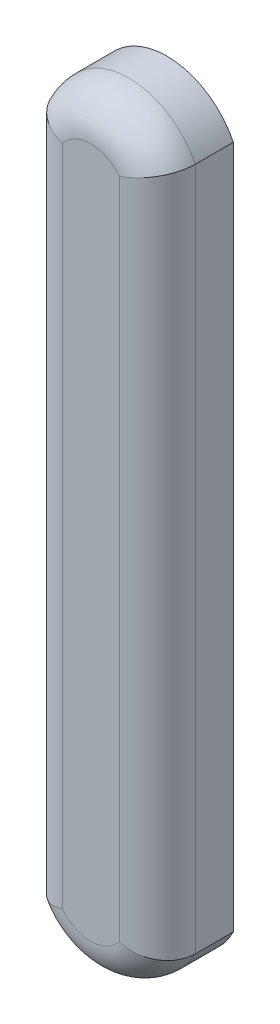
ISO-10303-21;
HEADER;
FILE_DESCRIPTION(('STEP AP214'),'2;1');
FILE_NAME('part.step','',(''),(''),'','','');
FILE_SCHEMA(('AUTOMOTIVE_DESIGN { 1 0 10303 214 1 1 1 1 }'));
ENDSEC;
DATA;
#1=APPLICATION_CONTEXT('core data for automotive mechanical design processes');
#2=APPLICATION_PROTOCOL_DEFINITION('international standard','automotive_design',2000,#1);
#3=PRODUCT_CONTEXT('',#1,'mechanical');
#4=PRODUCT('Part','Part','',(#3));
#5=PRODUCT_RELATED_PRODUCT_CATEGORY('part','',(#4));
#6=PRODUCT_DEFINITION_FORMATION('','',#4);
#7=PRODUCT_DEFINITION_CONTEXT('part definition',#1,'design');
#8=PRODUCT_DEFINITION('design','',#6,#7);
#9=PRODUCT_DEFINITION_SHAPE('','',#8);
#10=(LENGTH_UNIT() NAMED_UNIT(*) SI_UNIT(.MILLI.,.METRE.));
#11=(NAMED_UNIT(*) PLANE_ANGLE_UNIT() SI_UNIT($,.RADIAN.));
#12=(NAMED_UNIT(*) SI_UNIT($,.STERADIAN.) SOLID_ANGLE_UNIT());
#13=UNCERTAINTY_MEASURE_WITH_UNIT(LENGTH_MEASURE(1.E-05),#10,'distance_accuracy_value','');
#14=(GEOMETRIC_REPRESENTATION_CONTEXT(3) GLOBAL_UNCERTAINTY_ASSIGNED_CONTEXT((#13)) GLOBAL_UNIT_ASSIGNED_CONTEXT((#10,
#11,#12)) REPRESENTATION_CONTEXT('',''));
#15=CARTESIAN_POINT('',(0.,0.,0.));
#16=DIRECTION('',(0.,0.,1.));
#17=DIRECTION('',(1.,0.,0.));
#18=AXIS2_PLACEMENT_3D('',#15,#16,#17);
#19=CARTESIAN_POINT('',(0.175,0.085969826745946,0.2));
#20=DIRECTION('',(0.,0.,-1.));
#21=DIRECTION('',(-1.,0.,0.));
#22=AXIS2_PLACEMENT_3D('',#19,#20,#21);
#23=CYLINDRICAL_SURFACE('',#22,0.194976437321867);
#24=DIRECTION('',(0.,0.,-1.));
#25=VECTOR('',#24,1.);
#26=CARTESIAN_POINT('',(0.35,0.,0.2));
#27=LINE('',#26,#25);
#28=CARTESIAN_POINT('',(0.35,0.,0.1));
#29=VERTEX_POINT('',#28);
#30=CARTESIAN_POINT('',(0.35,0.,0.));
#31=VERTEX_POINT('',#30);
#32=EDGE_CURVE('E92',#29,#31,#27,.T.);
#33=ORIENTED_EDGE('',*,*,#32,.F.);
#34=CARTESIAN_POINT('',(0.175,0.085969826745946,0.1));
#35=DIRECTION('',(0.,0.,1.));
#36=DIRECTION('',(1.,0.,0.));
#37=AXIS2_PLACEMENT_3D('',#34,#35,#36);
#38=CIRCLE('',#37,0.194976437321867);
#39=CARTESIAN_POINT('',(0.,0.,0.1));
#40=VERTEX_POINT('',#39);
#41=EDGE_CURVE('E134',#29,#40,#38,.F.);
#42=ORIENTED_EDGE('',*,*,#41,.T.);
#43=DIRECTION('',(0.,0.,-1.));
#44=VECTOR('',#43,1.);
#45=CARTESIAN_POINT('',(0.,0.,0.2));
#46=LINE('',#45,#44);
#47=CARTESIAN_POINT('',(0.,0.,0.));
#48=VERTEX_POINT('',#47);
#49=EDGE_CURVE('E113',#40,#48,#46,.T.);
#50=ORIENTED_EDGE('',*,*,#49,.T.);
#51=CARTESIAN_POINT('',(0.175,0.085969826745946,0.));
#52=DIRECTION('',(0.,0.,1.));
#53=DIRECTION('',(1.,0.,0.));
#54=AXIS2_PLACEMENT_3D('',#51,#52,#53);
#55=CIRCLE('',#54,0.194976437321867);
#56=EDGE_CURVE('E109',#48,#31,#55,.T.);
#57=ORIENTED_EDGE('',*,*,#56,.T.);
#58=EDGE_LOOP('',(#33,#42,#50,#57));
#59=FACE_BOUND('',#58,.T.);
#60=ADVANCED_FACE('F33',(#59),#23,.T.);
#61=CARTESIAN_POINT('',(0.35,0.,0.2));
#62=DIRECTION('',(-1.,0.,0.));
#63=DIRECTION('',(0.,-1.,0.));
#64=AXIS2_PLACEMENT_3D('',#61,#62,#63);
#65=PLANE('',#64);
#66=DIRECTION('',(0.,0.,-1.));
#67=VECTOR('',#66,1.);
#68=CARTESIAN_POINT('',(0.35,1.8,0.2));
#69=LINE('',#68,#67);
#70=CARTESIAN_POINT('',(0.35,1.8,0.1));
#71=VERTEX_POINT('',#70);
#72=CARTESIAN_POINT('',(0.35,1.8,0.));
#73=VERTEX_POINT('',#72);
#74=EDGE_CURVE('E103',#71,#73,#69,.T.);
#75=ORIENTED_EDGE('',*,*,#74,.F.);
#76=DIRECTION('',(0.,1.,0.));
#77=VECTOR('',#76,1.);
#78=CARTESIAN_POINT('',(0.35,0.,0.1));
#79=LINE('',#78,#77);
#80=EDGE_CURVE('E47',#71,#29,#79,.F.);
#81=ORIENTED_EDGE('',*,*,#80,.T.);
#82=ORIENTED_EDGE('',*,*,#32,.T.);
#83=DIRECTION('',(0.,1.,0.));
#84=VECTOR('',#83,1.);
#85=CARTESIAN_POINT('',(0.35,0.,0.));
#86=LINE('',#85,#84);
#87=EDGE_CURVE('E95',#31,#73,#86,.T.);
#88=ORIENTED_EDGE('',*,*,#87,.T.);
#89=EDGE_LOOP('',(#75,#81,#82,#88));
#90=FACE_BOUND('',#89,.T.);
#91=ADVANCED_FACE('F94',(#90),#65,.F.);
#92=CARTESIAN_POINT('',(0.175,1.71403017325405,0.2));
#93=DIRECTION('',(0.,0.,-1.));
#94=DIRECTION('',(-1.,0.,0.));
#95=AXIS2_PLACEMENT_3D('',#92,#93,#94);
#96=CYLINDRICAL_SURFACE('',#95,0.194976437321867);
#97=DIRECTION('',(0.,0.,-1.));
#98=VECTOR('',#97,1.);
#99=CARTESIAN_POINT('',(0.,1.8,0.2));
#100=LINE('',#99,#98);
#101=CARTESIAN_POINT('',(0.,1.8,0.1));
#102=VERTEX_POINT('',#101);
#103=CARTESIAN_POINT('',(0.,1.8,0.));
#104=VERTEX_POINT('',#103);
#105=EDGE_CURVE('E123',#102,#104,#100,.T.);
#106=ORIENTED_EDGE('',*,*,#105,.F.);
#107=CARTESIAN_POINT('',(0.175,1.71403017325405,0.1));
#108=DIRECTION('',(0.,0.,1.));
#109=DIRECTION('',(1.,0.,0.));
#110=AXIS2_PLACEMENT_3D('',#107,#108,#109);
#111=CIRCLE('',#110,0.194976437321867);
#112=EDGE_CURVE('E11',#102,#71,#111,.F.);
#113=ORIENTED_EDGE('',*,*,#112,.T.);
#114=ORIENTED_EDGE('',*,*,#74,.T.);
#115=CARTESIAN_POINT('',(0.175,1.71403017325405,0.));
#116=DIRECTION('',(0.,0.,1.));
#117=DIRECTION('',(-1.,0.,0.));
#118=AXIS2_PLACEMENT_3D('',#115,#116,#117);
#119=CIRCLE('',#118,0.194976437321867);
#120=EDGE_CURVE('E111',#73,#104,#119,.T.);
#121=ORIENTED_EDGE('',*,*,#120,.T.);
#122=EDGE_LOOP('',(#106,#113,#114,#121));
#123=FACE_BOUND('',#122,.T.);
#124=ADVANCED_FACE('F176',(#123),#96,.T.);
#125=CARTESIAN_POINT('',(0.,0.,0.2));
#126=DIRECTION('',(1.,0.,0.));
#127=DIRECTION('',(0.,0.,-1.));
#128=AXIS2_PLACEMENT_3D('',#125,#126,#127);
#129=PLANE('',#128);
#130=ORIENTED_EDGE('',*,*,#49,.F.);
#131=DIRECTION('',(0.,-1.,0.));
#132=VECTOR('',#131,1.);
#133=CARTESIAN_POINT('',(0.,1.8,0.1));
#134=LINE('',#133,#132);
#135=EDGE_CURVE('E61',#40,#102,#134,.F.);
#136=ORIENTED_EDGE('',*,*,#135,.T.);
#137=ORIENTED_EDGE('',*,*,#105,.T.);
#138=DIRECTION('',(0.,-1.,0.));
#139=VECTOR('',#138,1.);
#140=CARTESIAN_POINT('',(0.,0.,0.));
#141=LINE('',#140,#139);
#142=EDGE_CURVE('E120',#104,#48,#141,.T.);
#143=ORIENTED_EDGE('',*,*,#142,.T.);
#144=EDGE_LOOP('',(#130,#136,#137,#143));
#145=FACE_BOUND('',#144,.T.);
#146=ADVANCED_FACE('F175',(#145),#129,.F.);
#147=CARTESIAN_POINT('',(0.175,0.085969826745946,0.2));
#148=DIRECTION('',(0.,0.,1.));
#149=DIRECTION('',(1.,0.,0.));
#150=AXIS2_PLACEMENT_3D('',#147,#148,#149);
#151=PLANE('',#150);
#152=DIRECTION('',(0.,-1.,0.));
#153=VECTOR('',#152,1.);
#154=CARTESIAN_POINT('',(0.1,0.,0.2));
#155=LINE('',#154,#153);
#156=CARTESIAN_POINT('',(0.100000000000006,1.77230129514437,0.2));
#157=VERTEX_POINT('',#156);
#158=CARTESIAN_POINT('',(0.1,0.0276987048556347,0.2));
#159=VERTEX_POINT('',#158);
#160=EDGE_CURVE('E129',#157,#159,#155,.T.);
#161=ORIENTED_EDGE('',*,*,#160,.T.);
#162=CARTESIAN_POINT('',(0.175,0.085969826745946,0.2));
#163=DIRECTION('',(0.,0.,1.));
#164=DIRECTION('',(1.,0.,0.));
#165=AXIS2_PLACEMENT_3D('',#162,#163,#164);
#166=CIRCLE('',#165,0.0949764373218671);
#167=CARTESIAN_POINT('',(0.25,0.027698704855635,0.2));
#168=VERTEX_POINT('',#167);
#169=EDGE_CURVE('E131',#159,#168,#166,.T.);
#170=ORIENTED_EDGE('',*,*,#169,.T.);
#171=DIRECTION('',(0.,1.,0.));
#172=VECTOR('',#171,1.);
#173=CARTESIAN_POINT('',(0.25,1.8,0.2));
#174=LINE('',#173,#172);
#175=CARTESIAN_POINT('',(0.249999999999993,1.77230129514436,0.2));
#176=VERTEX_POINT('',#175);
#177=EDGE_CURVE('E127',#168,#176,#174,.T.);
#178=ORIENTED_EDGE('',*,*,#177,.T.);
#179=CARTESIAN_POINT('',(0.175,1.71403017325405,0.2));
#180=DIRECTION('',(0.,0.,1.));
#181=DIRECTION('',(1.,0.,0.));
#182=AXIS2_PLACEMENT_3D('',#179,#180,#181);
#183=CIRCLE('',#182,0.0949764373218669);
#184=EDGE_CURVE('E102',#176,#157,#183,.T.);
#185=ORIENTED_EDGE('',*,*,#184,.T.);
#186=EDGE_LOOP('',(#161,#170,#178,#185));
#187=FACE_BOUND('',#186,.T.);
#188=ADVANCED_FACE('F180',(#187),#151,.T.);
#189=CARTESIAN_POINT('',(0.175,0.085969826745946,0.));
#190=DIRECTION('',(0.,0.,1.));
#191=DIRECTION('',(1.,0.,0.));
#192=AXIS2_PLACEMENT_3D('',#189,#190,#191);
#193=PLANE('',#192);
#194=ORIENTED_EDGE('',*,*,#56,.F.);
#195=ORIENTED_EDGE('',*,*,#142,.F.);
#196=ORIENTED_EDGE('',*,*,#120,.F.);
#197=ORIENTED_EDGE('',*,*,#87,.F.);
#198=EDGE_LOOP('',(#194,#195,#196,#197));
#199=FACE_BOUND('',#198,.T.);
#200=ADVANCED_FACE('F107',(#199),#193,.F.);
#201=CARTESIAN_POINT('',(0.175,1.71403017325405,0.1));
#202=DIRECTION('',(0.,0.,1.));
#203=DIRECTION('',(1.,0.,0.));
#204=AXIS2_PLACEMENT_3D('',#201,#202,#203);
#205=DEGENERATE_TOROIDAL_SURFACE('',#204,0.0949764373218669,0.1,.T.);
#206=CARTESIAN_POINT('',(0.35,1.8,0.1));
#207=CARTESIAN_POINT('',(0.350005268670267,1.80000040754592,0.105511252154056));
#208=CARTESIAN_POINT('',(0.349544726083473,1.79989418803524,0.111020433796739));
#209=CARTESIAN_POINT('',(0.347731528858172,1.79947173953325,0.121874551323155));
#210=CARTESIAN_POINT('',(0.346380049196348,1.79915578713593,0.127219693839957));
#211=CARTESIAN_POINT('',(0.342823791248484,1.79831698281915,0.137602422816504));
#212=CARTESIAN_POINT('',(0.340618769337371,1.7977940718269,0.142639920990146));
#213=CARTESIAN_POINT('',(0.335428566635514,1.79654702816146,0.152267062418119));
#214=CARTESIAN_POINT('',(0.332443445191161,1.79582291079487,0.156856739704144));
#215=CARTESIAN_POINT('',(0.325756614399062,1.79417319123095,0.165506423196409));
#216=CARTESIAN_POINT('',(0.322048708236535,1.79324583736037,0.169561300463762));
#217=CARTESIAN_POINT('',(0.314048358880856,1.79120195336536,0.176991039421652));
#218=CARTESIAN_POINT('',(0.309755728604854,1.79008536266644,0.18036568261043));
#219=CARTESIAN_POINT('',(0.30060896875744,1.7876441832273,0.186426554884238));
#220=CARTESIAN_POINT('',(0.295743946563813,1.78631529375002,0.189094582015616));
#221=CARTESIAN_POINT('',(0.285685701853069,1.78347998727226,0.193577836216799));
#222=CARTESIAN_POINT('',(0.280492611405467,1.78197364150132,0.195393404007875));
#223=CARTESIAN_POINT('',(0.271464682749297,1.77925574089153,0.197746196020681));
#224=CARTESIAN_POINT('',(0.267672328405755,1.77808525366685,0.198501401199194));
#225=CARTESIAN_POINT('',(0.260055477527481,1.77566401718499,0.199567195235984));
#226=CARTESIAN_POINT('',(0.25623103898922,1.77441339335639,0.199878461996797));
#227=CARTESIAN_POINT('',(0.251610866919886,1.77285157075458,0.199990299901761));
#228=CARTESIAN_POINT('',(0.250805058561447,1.77257728559771,0.200000031817378));
#229=CARTESIAN_POINT('',(0.25,1.77230129514436,0.2));
#230=B_SPLINE_CURVE_WITH_KNOTS('',3,(#206,#207,#208,#209,#210,#211,#212,#213,#214,#215,#216,
#217,#218,#219,#220,#221,#222,#223,#224,#225,#226,#227,#228,#229),.UNSPECIFIED.,.F.,.F.,(4,2,2,
2,2,2,2,2,2,2,2,4),(0.,0.0165104363716612,0.0329991420587914,0.0494925575628399,
0.0659847186886619,0.0826250435228637,0.0992707050000554,0.116310692768043,0.133343863977416,
0.145441145514401,0.157519934417857,0.160073462740983),.UNSPECIFIED.);
#231=EDGE_CURVE('E117',#71,#176,#230,.T.);
#232=ORIENTED_EDGE('',*,*,#231,.F.);
#233=ORIENTED_EDGE('',*,*,#112,.F.);
#234=CARTESIAN_POINT('',(0.,1.8,0.1));
#235=CARTESIAN_POINT('',(-5.26867026747834E-06,1.80000040754592,0.105511252154056));
#236=CARTESIAN_POINT('',(0.000455273916526679,1.79989418803524,0.111020433796739));
#237=CARTESIAN_POINT('',(0.00226847114182762,1.79947173953325,0.121874551323155));
#238=CARTESIAN_POINT('',(0.00361995080365192,1.79915578713593,0.127219693839957));
#239=CARTESIAN_POINT('',(0.00717620875151555,1.79831698281915,0.137602422816504));
#240=CARTESIAN_POINT('',(0.00938123066262877,1.7977940718269,0.142639920990146));
#241=CARTESIAN_POINT('',(0.0145714333644853,1.79654702816146,0.152267062418119));
#242=CARTESIAN_POINT('',(0.0175565548088385,1.79582291079487,0.156856739704144));
#243=CARTESIAN_POINT('',(0.0242433856009375,1.79417319123095,0.165506423196409));
#244=CARTESIAN_POINT('',(0.0279512917634644,1.79324583736037,0.169561300463762));
#245=CARTESIAN_POINT('',(0.0359516411191436,1.79120195336536,0.176991039421652));
#246=CARTESIAN_POINT('',(0.0402442713951461,1.79008536266644,0.18036568261043));
#247=CARTESIAN_POINT('',(0.0493910312425594,1.7876441832273,0.186426554884238));
#248=CARTESIAN_POINT('',(0.0542560534361864,1.78631529375002,0.189094582015616));
#249=CARTESIAN_POINT('',(0.0643142981469308,1.78347998727226,0.193577836216799));
#250=CARTESIAN_POINT('',(0.0695073885945331,1.78197364150132,0.195393404007875));
#251=CARTESIAN_POINT('',(0.078535317250703,1.77925574089153,0.197746196020681));
#252=CARTESIAN_POINT('',(0.0823276715942444,1.77808525366685,0.198501401199194));
#253=CARTESIAN_POINT('',(0.0899445224725191,1.77566401718499,0.199567195235984));
#254=CARTESIAN_POINT('',(0.0937689610107801,1.77441339335639,0.199878461996796));
#255=CARTESIAN_POINT('',(0.0983891330801135,1.77285157075458,0.199990299901761));
#256=CARTESIAN_POINT('',(0.0991949414385525,1.77257728559771,0.200000031817378));
#257=CARTESIAN_POINT('',(0.1,1.77230129514436,0.2));
#258=B_SPLINE_CURVE_WITH_KNOTS('',3,(#234,#235,#236,#237,#238,#239,#240,#241,#242,#243,#244,
#245,#246,#247,#248,#249,#250,#251,#252,#253,#254,#255,#256,#257),.UNSPECIFIED.,.F.,.F.,(4,2,2,
2,2,2,2,2,2,2,2,4),(0.,0.0165104363716612,0.0329991420587914,0.0494925575628399,
0.0659847186886619,0.0826250435228636,0.0992707050000554,0.116310692768043,0.133343863977416,
0.145441145514401,0.157519934417857,0.160073462740983),.UNSPECIFIED.);
#259=EDGE_CURVE('E38',#157,#102,#258,.F.);
#260=ORIENTED_EDGE('',*,*,#259,.F.);
#261=ORIENTED_EDGE('',*,*,#184,.F.);
#262=EDGE_LOOP('',(#232,#233,#260,#261));
#263=FACE_BOUND('',#262,.T.);
#264=ADVANCED_FACE('F35',(#263),#205,.T.);
#265=CARTESIAN_POINT('',(0.1,0.085969826745946,0.1));
#266=DIRECTION('',(0.,1.,0.));
#267=DIRECTION('',(0.,0.,1.));
#268=AXIS2_PLACEMENT_3D('',#265,#266,#267);
#269=CYLINDRICAL_SURFACE('',#268,0.1);
#270=ORIENTED_EDGE('',*,*,#259,.T.);
#271=ORIENTED_EDGE('',*,*,#135,.F.);
#272=CARTESIAN_POINT('',(0.,0.,0.1));
#273=CARTESIAN_POINT('',(-5.26867026749216E-06,-4.07545918185479E-07,0.105511252154056));
#274=CARTESIAN_POINT('',(0.00045527391652668,0.000105811964755276,0.111020433796739));
#275=CARTESIAN_POINT('',(0.00226847114182763,0.000528260466754383,0.121874551323155));
#276=CARTESIAN_POINT('',(0.00361995080365193,0.000844212864069837,0.127219693839957));
#277=CARTESIAN_POINT('',(0.00717620875151556,0.00168301718084986,0.137602422816504));
#278=CARTESIAN_POINT('',(0.00938123066262877,0.00220592817310251,0.142639920990146));
#279=CARTESIAN_POINT('',(0.0145714333644853,0.00345297183853665,0.152267062418119));
#280=CARTESIAN_POINT('',(0.0175565548088385,0.00417708920512622,0.156856739704144));
#281=CARTESIAN_POINT('',(0.0242433856009374,0.00582680876905395,0.165506423196409));
#282=CARTESIAN_POINT('',(0.0279512917634644,0.00675416263962706,0.169561300463762));
#283=CARTESIAN_POINT('',(0.0359516411191436,0.00879804663464358,0.176991039421652));
#284=CARTESIAN_POINT('',(0.0402442713951461,0.00991463733356386,0.18036568261043));
#285=CARTESIAN_POINT('',(0.0493910312425593,0.0123558167727029,0.186426554884238));
#286=CARTESIAN_POINT('',(0.0542560534361864,0.0136847062499831,0.189094582015616));
#287=CARTESIAN_POINT('',(0.0643142981469308,0.0165200127277394,0.193577836216799));
#288=CARTESIAN_POINT('',(0.0695073885945331,0.0180263584986779,0.195393404007875));
#289=CARTESIAN_POINT('',(0.078535317250703,0.0207442591084676,0.197746196020681));
#290=CARTESIAN_POINT('',(0.0823276715942444,0.0219147463331535,0.198501401199194));
#291=CARTESIAN_POINT('',(0.089944522472519,0.0243359828150111,0.199567195235984));
#292=CARTESIAN_POINT('',(0.0937689610107801,0.0255866066436063,0.199878461996796));
#293=CARTESIAN_POINT('',(0.0983891330801134,0.0271484292454207,0.199990299901761));
#294=CARTESIAN_POINT('',(0.0991949414385525,0.0274227144022896,0.200000031817378));
#295=CARTESIAN_POINT('',(0.1,0.0276987048556428,0.2));
#296=B_SPLINE_CURVE_WITH_KNOTS('',3,(#272,#273,#274,#275,#276,#277,#278,#279,#280,#281,#282,
#283,#284,#285,#286,#287,#288,#289,#290,#291,#292,#293,#294,#295),.UNSPECIFIED.,.F.,.F.,(4,2,2,
2,2,2,2,2,2,2,2,4),(0.,0.0165104363716612,0.0329991420587914,0.0494925575628399,
0.0659847186886618,0.0826250435228636,0.0992707050000554,0.116310692768043,0.133343863977416,
0.145441145514401,0.157519934417857,0.160073462740983),.UNSPECIFIED.);
#297=EDGE_CURVE('E146',#159,#40,#296,.F.);
#298=ORIENTED_EDGE('',*,*,#297,.F.);
#299=ORIENTED_EDGE('',*,*,#160,.F.);
#300=EDGE_LOOP('',(#270,#271,#298,#299));
#301=FACE_BOUND('',#300,.T.);
#302=ADVANCED_FACE('F157',(#301),#269,.T.);
#303=CARTESIAN_POINT('',(0.25,0.085969826745946,0.1));
#304=DIRECTION('',(0.,-1.,0.));
#305=DIRECTION('',(1.,0.,0.));
#306=AXIS2_PLACEMENT_3D('',#303,#304,#305);
#307=CYLINDRICAL_SURFACE('',#306,0.1);
#308=ORIENTED_EDGE('',*,*,#231,.T.);
#309=ORIENTED_EDGE('',*,*,#177,.F.);
#310=CARTESIAN_POINT('',(0.35,0.,0.1));
#311=CARTESIAN_POINT('',(0.350005268670267,-4.07545917922847E-07,0.105511252154056));
#312=CARTESIAN_POINT('',(0.349544726083473,0.000105811964755659,0.111020433796739));
#313=CARTESIAN_POINT('',(0.347731528858172,0.000528260466754883,0.121874551323155));
#314=CARTESIAN_POINT('',(0.346380049196348,0.000844212864070332,0.127219693839957));
#315=CARTESIAN_POINT('',(0.342823791248484,0.0016830171808503,0.137602422816504));
#316=CARTESIAN_POINT('',(0.340618769337371,0.00220592817310289,0.142639920990146));
#317=CARTESIAN_POINT('',(0.335428566635515,0.00345297183853705,0.152267062418119));
#318=CARTESIAN_POINT('',(0.332443445191161,0.00417708920512668,0.156856739704144));
#319=CARTESIAN_POINT('',(0.325756614399062,0.00582680876905445,0.165506423196409));
#320=CARTESIAN_POINT('',(0.322048708236536,0.00675416263962753,0.169561300463762));
#321=CARTESIAN_POINT('',(0.314048358880856,0.00879804663464405,0.176991039421652));
#322=CARTESIAN_POINT('',(0.309755728604854,0.00991463733356434,0.18036568261043));
#323=CARTESIAN_POINT('',(0.300608968757441,0.0123558167727033,0.186426554884238));
#324=CARTESIAN_POINT('',(0.295743946563813,0.0136847062499835,0.189094582015616));
#325=CARTESIAN_POINT('',(0.285685701853069,0.0165200127277398,0.193577836216799));
#326=CARTESIAN_POINT('',(0.280492611405467,0.0180263584986783,0.195393404007875));
#327=CARTESIAN_POINT('',(0.271464682749297,0.0207442591084679,0.197746196020681));
#328=CARTESIAN_POINT('',(0.267672328405755,0.0219147463331538,0.198501401199194));
#329=CARTESIAN_POINT('',(0.260055477527481,0.0243359828150114,0.199567195235984));
#330=CARTESIAN_POINT('',(0.25623103898922,0.0255866066436066,0.199878461996797));
#331=CARTESIAN_POINT('',(0.251610866919886,0.027148429245421,0.199990299901761));
#332=CARTESIAN_POINT('',(0.250805058561447,0.0274227144022899,0.200000031817378));
#333=CARTESIAN_POINT('',(0.25,0.0276987048556431,0.2));
#334=B_SPLINE_CURVE_WITH_KNOTS('',3,(#310,#311,#312,#313,#314,#315,#316,#317,#318,#319,#320,
#321,#322,#323,#324,#325,#326,#327,#328,#329,#330,#331,#332,#333),.UNSPECIFIED.,.F.,.F.,(4,2,2,
2,2,2,2,2,2,2,2,4),(0.,0.0165104363716612,0.0329991420587914,0.0494925575628399,
0.0659847186886619,0.0826250435228637,0.0992707050000555,0.116310692768043,0.133343863977416,
0.145441145514401,0.157519934417857,0.160073462740983),.UNSPECIFIED.);
#335=EDGE_CURVE('E138',#29,#168,#334,.T.);
#336=ORIENTED_EDGE('',*,*,#335,.F.);
#337=ORIENTED_EDGE('',*,*,#80,.F.);
#338=EDGE_LOOP('',(#308,#309,#336,#337));
#339=FACE_BOUND('',#338,.T.);
#340=ADVANCED_FACE('F154',(#339),#307,.T.);
#341=CARTESIAN_POINT('',(0.175,0.085969826745946,0.1));
#342=DIRECTION('',(0.,0.,1.));
#343=DIRECTION('',(1.,0.,0.));
#344=AXIS2_PLACEMENT_3D('',#341,#342,#343);
#345=DEGENERATE_TOROIDAL_SURFACE('',#344,0.0949764373218671,0.1,.T.);
#346=ORIENTED_EDGE('',*,*,#297,.T.);
#347=ORIENTED_EDGE('',*,*,#41,.F.);
#348=ORIENTED_EDGE('',*,*,#335,.T.);
#349=ORIENTED_EDGE('',*,*,#169,.F.);
#350=EDGE_LOOP('',(#346,#347,#348,#349));
#351=FACE_BOUND('',#350,.T.);
#352=ADVANCED_FACE('F151',(#351),#345,.T.);
#353=CLOSED_SHELL('',(#60,#91,#124,#146,#188,#200,#264,#302,#340,#352));
#354=MANIFOLD_SOLID_BREP('B2',#353);
#355=ADVANCED_BREP_SHAPE_REPRESENTATION('',(#18,#354),#14);
#356=SHAPE_DEFINITION_REPRESENTATION(#9,#355);
ENDSEC;
END-ISO-10303-21;
